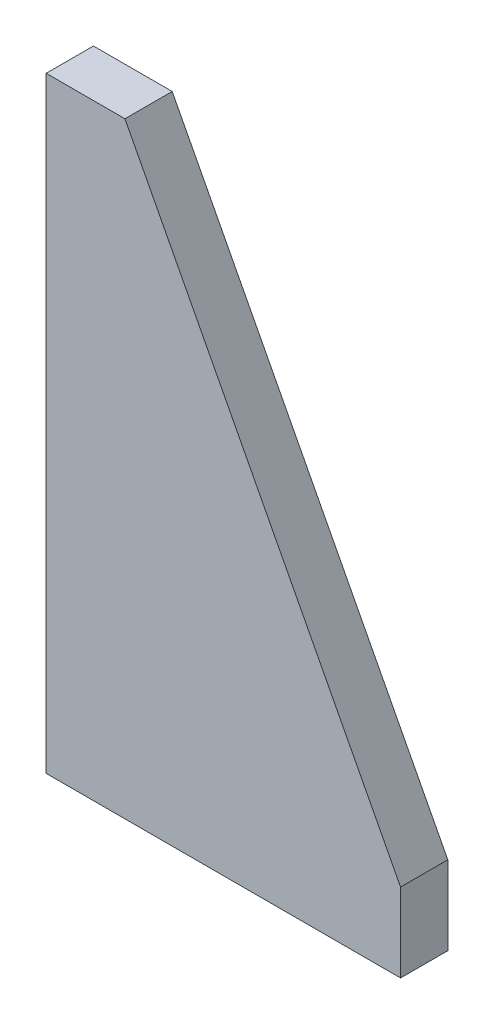
ISO-10303-21;
HEADER;
FILE_DESCRIPTION(('STEP AP214'),'2;1');
FILE_NAME('part.step','',(''),(''),'','','');
FILE_SCHEMA(('AUTOMOTIVE_DESIGN { 1 0 10303 214 1 1 1 1 }'));
ENDSEC;
DATA;
#1=APPLICATION_CONTEXT('core data for automotive mechanical design processes');
#2=APPLICATION_PROTOCOL_DEFINITION('international standard','automotive_design',2000,#1);
#3=PRODUCT_CONTEXT('',#1,'mechanical');
#4=PRODUCT('Part','Part','',(#3));
#5=PRODUCT_RELATED_PRODUCT_CATEGORY('part','',(#4));
#6=PRODUCT_DEFINITION_FORMATION('','',#4);
#7=PRODUCT_DEFINITION_CONTEXT('part definition',#1,'design');
#8=PRODUCT_DEFINITION('design','',#6,#7);
#9=PRODUCT_DEFINITION_SHAPE('','',#8);
#10=(LENGTH_UNIT() NAMED_UNIT(*) SI_UNIT(.MILLI.,.METRE.));
#11=(NAMED_UNIT(*) PLANE_ANGLE_UNIT() SI_UNIT($,.RADIAN.));
#12=(NAMED_UNIT(*) SI_UNIT($,.STERADIAN.) SOLID_ANGLE_UNIT());
#13=UNCERTAINTY_MEASURE_WITH_UNIT(LENGTH_MEASURE(1.E-05),#10,'distance_accuracy_value','');
#14=(GEOMETRIC_REPRESENTATION_CONTEXT(3) GLOBAL_UNCERTAINTY_ASSIGNED_CONTEXT((#13)) GLOBAL_UNIT_ASSIGNED_CONTEXT((#10,
#11,#12)) REPRESENTATION_CONTEXT('',''));
#15=CARTESIAN_POINT('',(0.,0.,0.));
#16=DIRECTION('',(0.,0.,1.));
#17=DIRECTION('',(1.,0.,0.));
#18=AXIS2_PLACEMENT_3D('',#15,#16,#17);
#19=CARTESIAN_POINT('',(0.,77.,3.));
#20=DIRECTION('',(0.,-1.,0.));
#21=DIRECTION('',(-1.,0.,0.));
#22=AXIS2_PLACEMENT_3D('',#19,#20,#21);
#23=PLANE('',#22);
#24=DIRECTION('',(0.,0.,1.));
#25=VECTOR('',#24,1.);
#26=CARTESIAN_POINT('',(10.,77.,3.));
#27=LINE('',#26,#25);
#28=CARTESIAN_POINT('',(10.,77.,-3.));
#29=VERTEX_POINT('',#28);
#30=CARTESIAN_POINT('',(10.,77.,3.));
#31=VERTEX_POINT('',#30);
#32=EDGE_CURVE('E11',#29,#31,#27,.T.);
#33=ORIENTED_EDGE('',*,*,#32,.F.);
#34=DIRECTION('',(-1.,0.,0.));
#35=VECTOR('',#34,1.);
#36=CARTESIAN_POINT('',(0.,77.,-3.));
#37=LINE('',#36,#35);
#38=CARTESIAN_POINT('',(0.,77.,-3.));
#39=VERTEX_POINT('',#38);
#40=EDGE_CURVE('E95',#29,#39,#37,.T.);
#41=ORIENTED_EDGE('',*,*,#40,.T.);
#42=DIRECTION('',(0.,0.,1.));
#43=VECTOR('',#42,1.);
#44=CARTESIAN_POINT('',(0.,77.,3.));
#45=LINE('',#44,#43);
#46=CARTESIAN_POINT('',(0.,77.,3.));
#47=VERTEX_POINT('',#46);
#48=EDGE_CURVE('E47',#39,#47,#45,.T.);
#49=ORIENTED_EDGE('',*,*,#48,.T.);
#50=DIRECTION('',(-1.,0.,0.));
#51=VECTOR('',#50,1.);
#52=CARTESIAN_POINT('',(0.,77.,3.));
#53=LINE('',#52,#51);
#54=EDGE_CURVE('E115',#31,#47,#53,.T.);
#55=ORIENTED_EDGE('',*,*,#54,.F.);
#56=EDGE_LOOP('',(#33,#41,#49,#55));
#57=FACE_BOUND('',#56,.T.);
#58=ADVANCED_FACE('F37',(#57),#23,.F.);
#59=CARTESIAN_POINT('',(0.,0.,3.));
#60=DIRECTION('',(1.,0.,0.));
#61=DIRECTION('',(0.,-1.,0.));
#62=AXIS2_PLACEMENT_3D('',#59,#60,#61);
#63=PLANE('',#62);
#64=ORIENTED_EDGE('',*,*,#48,.F.);
#65=DIRECTION('',(0.,1.,0.));
#66=VECTOR('',#65,1.);
#67=CARTESIAN_POINT('',(0.,0.,-3.));
#68=LINE('',#67,#66);
#69=CARTESIAN_POINT('',(0.,0.,-3.));
#70=VERTEX_POINT('',#69);
#71=EDGE_CURVE('E105',#39,#70,#68,.F.);
#72=ORIENTED_EDGE('',*,*,#71,.T.);
#73=DIRECTION('',(0.,0.,1.));
#74=VECTOR('',#73,1.);
#75=CARTESIAN_POINT('',(0.,0.,3.));
#76=LINE('',#75,#74);
#77=CARTESIAN_POINT('',(0.,0.,3.));
#78=VERTEX_POINT('',#77);
#79=EDGE_CURVE('E110',#70,#78,#76,.T.);
#80=ORIENTED_EDGE('',*,*,#79,.T.);
#81=DIRECTION('',(0.,-1.,0.));
#82=VECTOR('',#81,1.);
#83=CARTESIAN_POINT('',(0.,0.,3.));
#84=LINE('',#83,#82);
#85=EDGE_CURVE('E122',#47,#78,#84,.T.);
#86=ORIENTED_EDGE('',*,*,#85,.F.);
#87=EDGE_LOOP('',(#64,#72,#80,#86));
#88=FACE_BOUND('',#87,.T.);
#89=ADVANCED_FACE('F124',(#88),#63,.F.);
#90=CARTESIAN_POINT('',(45.,0.,3.));
#91=DIRECTION('',(0.,1.,0.));
#92=DIRECTION('',(1.,0.,0.));
#93=AXIS2_PLACEMENT_3D('',#90,#91,#92);
#94=PLANE('',#93);
#95=ORIENTED_EDGE('',*,*,#79,.F.);
#96=DIRECTION('',(-1.,0.,0.));
#97=VECTOR('',#96,1.);
#98=CARTESIAN_POINT('',(0.,0.,-3.));
#99=LINE('',#98,#97);
#100=CARTESIAN_POINT('',(45.,0.,-3.));
#101=VERTEX_POINT('',#100);
#102=EDGE_CURVE('E102',#70,#101,#99,.F.);
#103=ORIENTED_EDGE('',*,*,#102,.T.);
#104=DIRECTION('',(0.,0.,1.));
#105=VECTOR('',#104,1.);
#106=CARTESIAN_POINT('',(45.,0.,3.));
#107=LINE('',#106,#105);
#108=CARTESIAN_POINT('',(45.,0.,3.));
#109=VERTEX_POINT('',#108);
#110=EDGE_CURVE('E55',#101,#109,#107,.T.);
#111=ORIENTED_EDGE('',*,*,#110,.T.);
#112=DIRECTION('',(1.,0.,0.));
#113=VECTOR('',#112,1.);
#114=CARTESIAN_POINT('',(45.,0.,3.));
#115=LINE('',#114,#113);
#116=EDGE_CURVE('E88',#78,#109,#115,.T.);
#117=ORIENTED_EDGE('',*,*,#116,.F.);
#118=EDGE_LOOP('',(#95,#103,#111,#117));
#119=FACE_BOUND('',#118,.T.);
#120=ADVANCED_FACE('F129',(#119),#94,.F.);
#121=CARTESIAN_POINT('',(45.,10.,3.));
#122=DIRECTION('',(-1.,0.,0.));
#123=DIRECTION('',(0.,1.,0.));
#124=AXIS2_PLACEMENT_3D('',#121,#122,#123);
#125=PLANE('',#124);
#126=ORIENTED_EDGE('',*,*,#110,.F.);
#127=DIRECTION('',(0.,1.,0.));
#128=VECTOR('',#127,1.);
#129=CARTESIAN_POINT('',(45.,0.,-3.));
#130=LINE('',#129,#128);
#131=CARTESIAN_POINT('',(45.,10.,-3.));
#132=VERTEX_POINT('',#131);
#133=EDGE_CURVE('E93',#101,#132,#130,.T.);
#134=ORIENTED_EDGE('',*,*,#133,.T.);
#135=DIRECTION('',(0.,0.,1.));
#136=VECTOR('',#135,1.);
#137=CARTESIAN_POINT('',(45.,10.,3.));
#138=LINE('',#137,#136);
#139=CARTESIAN_POINT('',(45.,10.,3.));
#140=VERTEX_POINT('',#139);
#141=EDGE_CURVE('E41',#132,#140,#138,.T.);
#142=ORIENTED_EDGE('',*,*,#141,.T.);
#143=DIRECTION('',(0.,1.,0.));
#144=VECTOR('',#143,1.);
#145=CARTESIAN_POINT('',(45.,10.,3.));
#146=LINE('',#145,#144);
#147=EDGE_CURVE('E104',#109,#140,#146,.T.);
#148=ORIENTED_EDGE('',*,*,#147,.F.);
#149=EDGE_LOOP('',(#126,#134,#142,#148));
#150=FACE_BOUND('',#149,.T.);
#151=ADVANCED_FACE('F97',(#150),#125,.F.);
#152=CARTESIAN_POINT('',(10.,77.,3.));
#153=DIRECTION('',(-0.886348848204834,-0.463018055032376,0.));
#154=DIRECTION('',(-0.463018055032376,0.886348848204834,0.));
#155=AXIS2_PLACEMENT_3D('',#152,#153,#154);
#156=PLANE('',#155);
#157=DIRECTION('',(-0.463018055032376,0.886348848204834,0.));
#158=VECTOR('',#157,1.);
#159=CARTESIAN_POINT('',(10.,77.,-3.));
#160=LINE('',#159,#158);
#161=EDGE_CURVE('E82',#132,#29,#160,.T.);
#162=ORIENTED_EDGE('',*,*,#161,.T.);
#163=ORIENTED_EDGE('',*,*,#32,.T.);
#164=DIRECTION('',(-0.463018055032376,0.886348848204834,0.));
#165=VECTOR('',#164,1.);
#166=CARTESIAN_POINT('',(10.,77.,3.));
#167=LINE('',#166,#165);
#168=EDGE_CURVE('E84',#140,#31,#167,.T.);
#169=ORIENTED_EDGE('',*,*,#168,.F.);
#170=ORIENTED_EDGE('',*,*,#141,.F.);
#171=EDGE_LOOP('',(#162,#163,#169,#170));
#172=FACE_BOUND('',#171,.T.);
#173=ADVANCED_FACE('F39',(#172),#156,.F.);
#174=CARTESIAN_POINT('',(0.,0.,3.));
#175=DIRECTION('',(0.,0.,-1.));
#176=DIRECTION('',(-1.,0.,0.));
#177=AXIS2_PLACEMENT_3D('',#174,#175,#176);
#178=PLANE('',#177);
#179=ORIENTED_EDGE('',*,*,#147,.T.);
#180=ORIENTED_EDGE('',*,*,#168,.T.);
#181=ORIENTED_EDGE('',*,*,#54,.T.);
#182=ORIENTED_EDGE('',*,*,#85,.T.);
#183=ORIENTED_EDGE('',*,*,#116,.T.);
#184=EDGE_LOOP('',(#179,#180,#181,#182,#183));
#185=FACE_BOUND('',#184,.T.);
#186=ADVANCED_FACE('F120',(#185),#178,.F.);
#187=CARTESIAN_POINT('',(0.,0.,-3.));
#188=DIRECTION('',(0.,0.,-1.));
#189=DIRECTION('',(-1.,0.,0.));
#190=AXIS2_PLACEMENT_3D('',#187,#188,#189);
#191=PLANE('',#190);
#192=ORIENTED_EDGE('',*,*,#133,.F.);
#193=ORIENTED_EDGE('',*,*,#102,.F.);
#194=ORIENTED_EDGE('',*,*,#71,.F.);
#195=ORIENTED_EDGE('',*,*,#40,.F.);
#196=ORIENTED_EDGE('',*,*,#161,.F.);
#197=EDGE_LOOP('',(#192,#193,#194,#195,#196));
#198=FACE_BOUND('',#197,.T.);
#199=ADVANCED_FACE('F91',(#198),#191,.T.);
#200=CLOSED_SHELL('',(#58,#89,#120,#151,#173,#186,#199));
#201=MANIFOLD_SOLID_BREP('B2',#200);
#202=ADVANCED_BREP_SHAPE_REPRESENTATION('',(#18,#201),#14);
#203=SHAPE_DEFINITION_REPRESENTATION(#9,#202);
ENDSEC;
END-ISO-10303-21;
